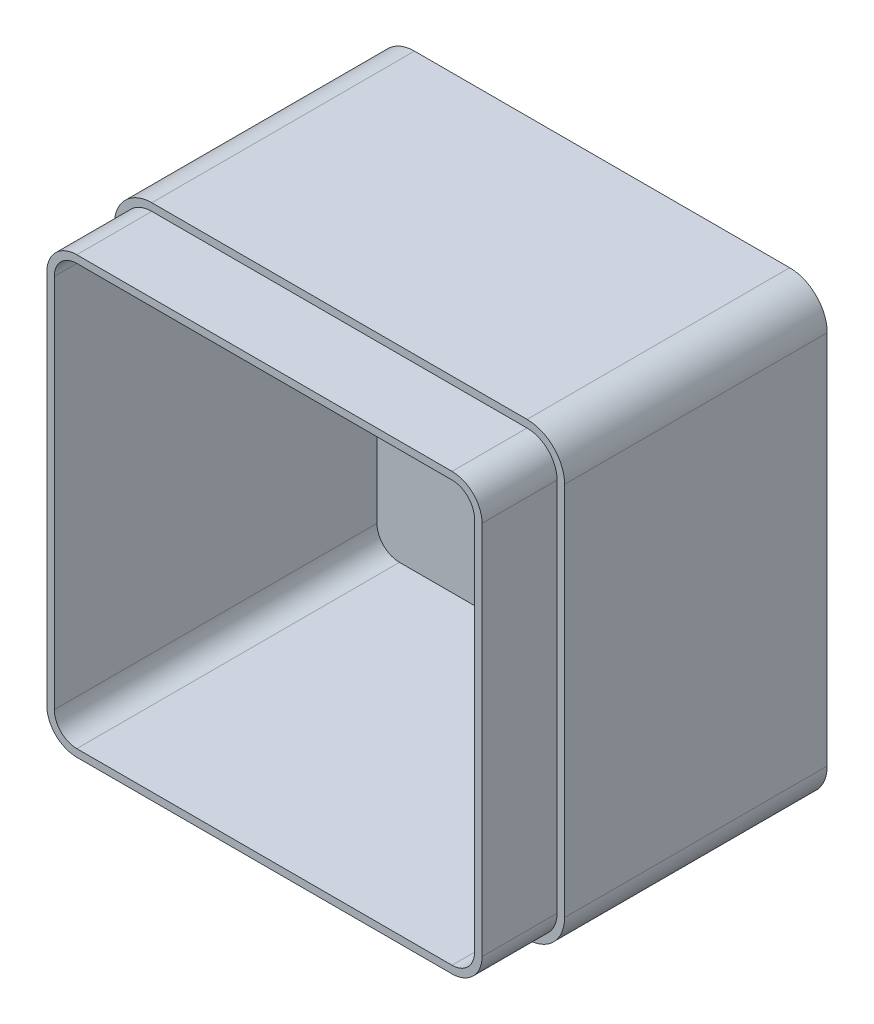
ISO-10303-21;
HEADER;
FILE_DESCRIPTION(('STEP AP214'),'2;1');
FILE_NAME('part.step','',(''),(''),'','','');
FILE_SCHEMA(('AUTOMOTIVE_DESIGN { 1 0 10303 214 1 1 1 1 }'));
ENDSEC;
DATA;
#1=APPLICATION_CONTEXT('core data for automotive mechanical design processes');
#2=APPLICATION_PROTOCOL_DEFINITION('international standard','automotive_design',2000,#1);
#3=PRODUCT_CONTEXT('',#1,'mechanical');
#4=PRODUCT('Part','Part','',(#3));
#5=PRODUCT_RELATED_PRODUCT_CATEGORY('part','',(#4));
#6=PRODUCT_DEFINITION_FORMATION('','',#4);
#7=PRODUCT_DEFINITION_CONTEXT('part definition',#1,'design');
#8=PRODUCT_DEFINITION('design','',#6,#7);
#9=PRODUCT_DEFINITION_SHAPE('','',#8);
#10=(LENGTH_UNIT() NAMED_UNIT(*) SI_UNIT(.MILLI.,.METRE.));
#11=(NAMED_UNIT(*) PLANE_ANGLE_UNIT() SI_UNIT($,.RADIAN.));
#12=(NAMED_UNIT(*) SI_UNIT($,.STERADIAN.) SOLID_ANGLE_UNIT());
#13=UNCERTAINTY_MEASURE_WITH_UNIT(LENGTH_MEASURE(1.E-05),#10,'distance_accuracy_value','');
#14=(GEOMETRIC_REPRESENTATION_CONTEXT(3) GLOBAL_UNCERTAINTY_ASSIGNED_CONTEXT((#13)) GLOBAL_UNIT_ASSIGNED_CONTEXT((#10,
#11,#12)) REPRESENTATION_CONTEXT('',''));
#15=CARTESIAN_POINT('',(0.,0.,0.));
#16=DIRECTION('',(0.,0.,1.));
#17=DIRECTION('',(1.,0.,0.));
#18=AXIS2_PLACEMENT_3D('',#15,#16,#17);
#19=CARTESIAN_POINT('',(0.,0.,90.));
#20=DIRECTION('',(0.,0.,-1.));
#21=DIRECTION('',(-1.,0.,0.));
#22=AXIS2_PLACEMENT_3D('',#19,#20,#21);
#23=PLANE('',#22);
#24=DIRECTION('',(0.,-1.,0.));
#25=VECTOR('',#24,1.);
#26=CARTESIAN_POINT('',(4.,0.,90.));
#27=LINE('',#26,#25);
#28=CARTESIAN_POINT('',(4.,110.,90.));
#29=VERTEX_POINT('',#28);
#30=CARTESIAN_POINT('',(4.,10.,90.));
#31=VERTEX_POINT('',#30);
#32=EDGE_CURVE('E304',#29,#31,#27,.T.);
#33=ORIENTED_EDGE('',*,*,#32,.F.);
#34=CARTESIAN_POINT('',(10.,110.,90.));
#35=DIRECTION('',(0.,0.,-1.));
#36=DIRECTION('',(-1.,0.,0.));
#37=AXIS2_PLACEMENT_3D('',#34,#35,#36);
#38=CIRCLE('',#37,6.);
#39=CARTESIAN_POINT('',(10.,116.,90.));
#40=VERTEX_POINT('',#39);
#41=EDGE_CURVE('E287',#40,#29,#38,.F.);
#42=ORIENTED_EDGE('',*,*,#41,.F.);
#43=DIRECTION('',(-1.,0.,0.));
#44=VECTOR('',#43,1.);
#45=CARTESIAN_POINT('',(0.,116.,90.));
#46=LINE('',#45,#44);
#47=CARTESIAN_POINT('',(110.,116.,90.));
#48=VERTEX_POINT('',#47);
#49=EDGE_CURVE('E313',#48,#40,#46,.T.);
#50=ORIENTED_EDGE('',*,*,#49,.F.);
#51=CARTESIAN_POINT('',(110.,110.,90.));
#52=DIRECTION('',(0.,0.,-1.));
#53=DIRECTION('',(-1.,0.,0.));
#54=AXIS2_PLACEMENT_3D('',#51,#52,#53);
#55=CIRCLE('',#54,6.);
#56=CARTESIAN_POINT('',(116.,110.,90.));
#57=VERTEX_POINT('',#56);
#58=EDGE_CURVE('E336',#57,#48,#55,.F.);
#59=ORIENTED_EDGE('',*,*,#58,.F.);
#60=DIRECTION('',(0.,1.,0.));
#61=VECTOR('',#60,1.);
#62=CARTESIAN_POINT('',(116.,0.,90.));
#63=LINE('',#62,#61);
#64=CARTESIAN_POINT('',(116.,10.,90.));
#65=VERTEX_POINT('',#64);
#66=EDGE_CURVE('E334',#65,#57,#63,.T.);
#67=ORIENTED_EDGE('',*,*,#66,.F.);
#68=CARTESIAN_POINT('',(110.,10.,90.));
#69=DIRECTION('',(0.,0.,-1.));
#70=DIRECTION('',(-1.,0.,0.));
#71=AXIS2_PLACEMENT_3D('',#68,#69,#70);
#72=CIRCLE('',#71,6.);
#73=CARTESIAN_POINT('',(110.,4.,90.));
#74=VERTEX_POINT('',#73);
#75=EDGE_CURVE('E331',#74,#65,#72,.F.);
#76=ORIENTED_EDGE('',*,*,#75,.F.);
#77=DIRECTION('',(1.,0.,0.));
#78=VECTOR('',#77,1.);
#79=CARTESIAN_POINT('',(0.,4.,90.));
#80=LINE('',#79,#78);
#81=CARTESIAN_POINT('',(10.,4.,90.));
#82=VERTEX_POINT('',#81);
#83=EDGE_CURVE('E329',#82,#74,#80,.T.);
#84=ORIENTED_EDGE('',*,*,#83,.F.);
#85=CARTESIAN_POINT('',(10.,10.,90.));
#86=DIRECTION('',(0.,0.,-1.));
#87=DIRECTION('',(-1.,0.,0.));
#88=AXIS2_PLACEMENT_3D('',#85,#86,#87);
#89=CIRCLE('',#88,6.);
#90=EDGE_CURVE('E320',#31,#82,#89,.F.);
#91=ORIENTED_EDGE('',*,*,#90,.F.);
#92=EDGE_LOOP('',(#33,#42,#50,#59,#67,#76,#84,#91));
#93=FACE_BOUND('',#92,.T.);
#94=CARTESIAN_POINT('',(10.,110.,90.));
#95=DIRECTION('',(0.,0.,1.));
#96=DIRECTION('',(1.,0.,0.));
#97=AXIS2_PLACEMENT_3D('',#94,#95,#96);
#98=CIRCLE('',#97,8.);
#99=CARTESIAN_POINT('',(10.,118.,90.));
#100=VERTEX_POINT('',#99);
#101=CARTESIAN_POINT('',(2.,110.,90.));
#102=VERTEX_POINT('',#101);
#103=EDGE_CURVE('E239',#100,#102,#98,.T.);
#104=ORIENTED_EDGE('',*,*,#103,.T.);
#105=DIRECTION('',(0.,-1.,0.));
#106=VECTOR('',#105,1.);
#107=CARTESIAN_POINT('',(2.,110.,90.));
#108=LINE('',#107,#106);
#109=CARTESIAN_POINT('',(2.,10.,90.));
#110=VERTEX_POINT('',#109);
#111=EDGE_CURVE('E199',#102,#110,#108,.T.);
#112=ORIENTED_EDGE('',*,*,#111,.T.);
#113=CARTESIAN_POINT('',(10.,10.,90.));
#114=DIRECTION('',(0.,0.,1.));
#115=DIRECTION('',(1.,0.,0.));
#116=AXIS2_PLACEMENT_3D('',#113,#114,#115);
#117=CIRCLE('',#116,8.);
#118=CARTESIAN_POINT('',(10.,2.,90.));
#119=VERTEX_POINT('',#118);
#120=EDGE_CURVE('E48',#110,#119,#117,.T.);
#121=ORIENTED_EDGE('',*,*,#120,.T.);
#122=DIRECTION('',(1.,0.,0.));
#123=VECTOR('',#122,1.);
#124=CARTESIAN_POINT('',(10.,2.,90.));
#125=LINE('',#124,#123);
#126=CARTESIAN_POINT('',(110.,2.,90.));
#127=VERTEX_POINT('',#126);
#128=EDGE_CURVE('E243',#119,#127,#125,.T.);
#129=ORIENTED_EDGE('',*,*,#128,.T.);
#130=CARTESIAN_POINT('',(110.,10.,90.));
#131=DIRECTION('',(0.,0.,1.));
#132=DIRECTION('',(1.,0.,0.));
#133=AXIS2_PLACEMENT_3D('',#130,#131,#132);
#134=CIRCLE('',#133,8.);
#135=CARTESIAN_POINT('',(118.,10.,90.));
#136=VERTEX_POINT('',#135);
#137=EDGE_CURVE('E246',#127,#136,#134,.T.);
#138=ORIENTED_EDGE('',*,*,#137,.T.);
#139=DIRECTION('',(0.,1.,0.));
#140=VECTOR('',#139,1.);
#141=CARTESIAN_POINT('',(118.,10.,90.));
#142=LINE('',#141,#140);
#143=CARTESIAN_POINT('',(118.,110.,90.));
#144=VERTEX_POINT('',#143);
#145=EDGE_CURVE('E249',#136,#144,#142,.T.);
#146=ORIENTED_EDGE('',*,*,#145,.T.);
#147=CARTESIAN_POINT('',(110.,110.,90.));
#148=DIRECTION('',(0.,0.,1.));
#149=DIRECTION('',(1.,0.,0.));
#150=AXIS2_PLACEMENT_3D('',#147,#148,#149);
#151=CIRCLE('',#150,7.99999999999999);
#152=CARTESIAN_POINT('',(110.,118.,90.));
#153=VERTEX_POINT('',#152);
#154=EDGE_CURVE('E222',#144,#153,#151,.T.);
#155=ORIENTED_EDGE('',*,*,#154,.T.);
#156=DIRECTION('',(-1.,0.,0.));
#157=VECTOR('',#156,1.);
#158=CARTESIAN_POINT('',(110.,118.,90.));
#159=LINE('',#158,#157);
#160=EDGE_CURVE('E219',#153,#100,#159,.T.);
#161=ORIENTED_EDGE('',*,*,#160,.T.);
#162=EDGE_LOOP('',(#104,#112,#121,#129,#138,#146,#155,#161));
#163=FACE_BOUND('',#162,.T.);
#164=ADVANCED_FACE('F33',(#93,#163),#23,.F.);
#165=CARTESIAN_POINT('',(4.,0.,90.));
#166=DIRECTION('',(1.,0.,0.));
#167=DIRECTION('',(0.,0.,-1.));
#168=AXIS2_PLACEMENT_3D('',#165,#166,#167);
#169=PLANE('',#168);
#170=DIRECTION('',(0.,-1.,0.));
#171=VECTOR('',#170,1.);
#172=CARTESIAN_POINT('',(4.,0.,4.));
#173=LINE('',#172,#171);
#174=CARTESIAN_POINT('',(4.,110.,4.));
#175=VERTEX_POINT('',#174);
#176=CARTESIAN_POINT('',(4.,10.,4.));
#177=VERTEX_POINT('',#176);
#178=EDGE_CURVE('E281',#175,#177,#173,.T.);
#179=ORIENTED_EDGE('',*,*,#178,.F.);
#180=DIRECTION('',(0.,0.,-1.));
#181=VECTOR('',#180,1.);
#182=CARTESIAN_POINT('',(4.,110.,90.));
#183=LINE('',#182,#181);
#184=EDGE_CURVE('E288',#29,#175,#183,.T.);
#185=ORIENTED_EDGE('',*,*,#184,.F.);
#186=ORIENTED_EDGE('',*,*,#32,.T.);
#187=DIRECTION('',(0.,0.,-1.));
#188=VECTOR('',#187,1.);
#189=CARTESIAN_POINT('',(4.,10.,90.));
#190=LINE('',#189,#188);
#191=EDGE_CURVE('E285',#177,#31,#190,.F.);
#192=ORIENTED_EDGE('',*,*,#191,.F.);
#193=EDGE_LOOP('',(#179,#185,#186,#192));
#194=FACE_BOUND('',#193,.T.);
#195=ADVANCED_FACE('F426',(#194),#169,.T.);
#196=CARTESIAN_POINT('',(0.,4.,90.));
#197=DIRECTION('',(0.,1.,0.));
#198=DIRECTION('',(0.,0.,1.));
#199=AXIS2_PLACEMENT_3D('',#196,#197,#198);
#200=PLANE('',#199);
#201=ORIENTED_EDGE('',*,*,#83,.T.);
#202=DIRECTION('',(0.,0.,1.));
#203=VECTOR('',#202,1.);
#204=CARTESIAN_POINT('',(110.,4.,90.));
#205=LINE('',#204,#203);
#206=CARTESIAN_POINT('',(110.,4.,4.));
#207=VERTEX_POINT('',#206);
#208=EDGE_CURVE('E311',#207,#74,#205,.T.);
#209=ORIENTED_EDGE('',*,*,#208,.F.);
#210=DIRECTION('',(1.,0.,0.));
#211=VECTOR('',#210,1.);
#212=CARTESIAN_POINT('',(0.,4.,4.));
#213=LINE('',#212,#211);
#214=CARTESIAN_POINT('',(10.,4.,4.));
#215=VERTEX_POINT('',#214);
#216=EDGE_CURVE('E284',#215,#207,#213,.T.);
#217=ORIENTED_EDGE('',*,*,#216,.F.);
#218=DIRECTION('',(0.,0.,1.));
#219=VECTOR('',#218,1.);
#220=CARTESIAN_POINT('',(10.,4.,90.));
#221=LINE('',#220,#219);
#222=EDGE_CURVE('E300',#82,#215,#221,.F.);
#223=ORIENTED_EDGE('',*,*,#222,.F.);
#224=EDGE_LOOP('',(#201,#209,#217,#223));
#225=FACE_BOUND('',#224,.T.);
#226=ADVANCED_FACE('F431',(#225),#200,.T.);
#227=CARTESIAN_POINT('',(116.,0.,90.));
#228=DIRECTION('',(-1.,0.,0.));
#229=DIRECTION('',(0.,0.,1.));
#230=AXIS2_PLACEMENT_3D('',#227,#228,#229);
#231=PLANE('',#230);
#232=ORIENTED_EDGE('',*,*,#66,.T.);
#233=DIRECTION('',(0.,0.,1.));
#234=VECTOR('',#233,1.);
#235=CARTESIAN_POINT('',(116.,110.,90.));
#236=LINE('',#235,#234);
#237=CARTESIAN_POINT('',(116.,110.,4.));
#238=VERTEX_POINT('',#237);
#239=EDGE_CURVE('E318',#238,#57,#236,.T.);
#240=ORIENTED_EDGE('',*,*,#239,.F.);
#241=DIRECTION('',(0.,1.,0.));
#242=VECTOR('',#241,1.);
#243=CARTESIAN_POINT('',(116.,0.,4.));
#244=LINE('',#243,#242);
#245=CARTESIAN_POINT('',(116.,10.,4.));
#246=VERTEX_POINT('',#245);
#247=EDGE_CURVE('E294',#246,#238,#244,.T.);
#248=ORIENTED_EDGE('',*,*,#247,.F.);
#249=DIRECTION('',(0.,0.,1.));
#250=VECTOR('',#249,1.);
#251=CARTESIAN_POINT('',(116.,10.,90.));
#252=LINE('',#251,#250);
#253=EDGE_CURVE('E314',#65,#246,#252,.F.);
#254=ORIENTED_EDGE('',*,*,#253,.F.);
#255=EDGE_LOOP('',(#232,#240,#248,#254));
#256=FACE_BOUND('',#255,.T.);
#257=ADVANCED_FACE('F460',(#256),#231,.T.);
#258=CARTESIAN_POINT('',(0.,116.,90.));
#259=DIRECTION('',(0.,-1.,0.));
#260=DIRECTION('',(0.,0.,-1.));
#261=AXIS2_PLACEMENT_3D('',#258,#259,#260);
#262=PLANE('',#261);
#263=ORIENTED_EDGE('',*,*,#49,.T.);
#264=DIRECTION('',(0.,0.,-1.));
#265=VECTOR('',#264,1.);
#266=CARTESIAN_POINT('',(10.,116.,90.));
#267=LINE('',#266,#265);
#268=CARTESIAN_POINT('',(10.,116.,4.));
#269=VERTEX_POINT('',#268);
#270=EDGE_CURVE('E317',#269,#40,#267,.F.);
#271=ORIENTED_EDGE('',*,*,#270,.F.);
#272=DIRECTION('',(-1.,0.,0.));
#273=VECTOR('',#272,1.);
#274=CARTESIAN_POINT('',(0.,116.,4.));
#275=LINE('',#274,#273);
#276=CARTESIAN_POINT('',(110.,116.,4.));
#277=VERTEX_POINT('',#276);
#278=EDGE_CURVE('E301',#277,#269,#275,.T.);
#279=ORIENTED_EDGE('',*,*,#278,.F.);
#280=DIRECTION('',(0.,0.,-1.));
#281=VECTOR('',#280,1.);
#282=CARTESIAN_POINT('',(110.,116.,90.));
#283=LINE('',#282,#281);
#284=EDGE_CURVE('E321',#48,#277,#283,.T.);
#285=ORIENTED_EDGE('',*,*,#284,.F.);
#286=EDGE_LOOP('',(#263,#271,#279,#285));
#287=FACE_BOUND('',#286,.T.);
#288=ADVANCED_FACE('F456',(#287),#262,.T.);
#289=CARTESIAN_POINT('',(0.,0.,4.));
#290=DIRECTION('',(0.,0.,-1.));
#291=DIRECTION('',(-1.,0.,0.));
#292=AXIS2_PLACEMENT_3D('',#289,#290,#291);
#293=PLANE('',#292);
#294=ORIENTED_EDGE('',*,*,#216,.T.);
#295=CARTESIAN_POINT('',(110.,10.,4.));
#296=DIRECTION('',(0.,0.,-1.));
#297=DIRECTION('',(-1.,0.,0.));
#298=AXIS2_PLACEMENT_3D('',#295,#296,#297);
#299=CIRCLE('',#298,6.);
#300=EDGE_CURVE('E296',#246,#207,#299,.T.);
#301=ORIENTED_EDGE('',*,*,#300,.F.);
#302=ORIENTED_EDGE('',*,*,#247,.T.);
#303=CARTESIAN_POINT('',(110.,110.,4.));
#304=DIRECTION('',(0.,0.,-1.));
#305=DIRECTION('',(-1.,0.,0.));
#306=AXIS2_PLACEMENT_3D('',#303,#304,#305);
#307=CIRCLE('',#306,6.);
#308=EDGE_CURVE('E299',#277,#238,#307,.T.);
#309=ORIENTED_EDGE('',*,*,#308,.F.);
#310=ORIENTED_EDGE('',*,*,#278,.T.);
#311=CARTESIAN_POINT('',(10.,110.,4.));
#312=DIRECTION('',(0.,0.,-1.));
#313=DIRECTION('',(-1.,0.,0.));
#314=AXIS2_PLACEMENT_3D('',#311,#312,#313);
#315=CIRCLE('',#314,6.);
#316=EDGE_CURVE('E297',#175,#269,#315,.T.);
#317=ORIENTED_EDGE('',*,*,#316,.F.);
#318=ORIENTED_EDGE('',*,*,#178,.T.);
#319=CARTESIAN_POINT('',(10.,10.,4.));
#320=DIRECTION('',(0.,0.,-1.));
#321=DIRECTION('',(-1.,0.,0.));
#322=AXIS2_PLACEMENT_3D('',#319,#320,#321);
#323=CIRCLE('',#322,6.);
#324=EDGE_CURVE('E291',#215,#177,#323,.T.);
#325=ORIENTED_EDGE('',*,*,#324,.F.);
#326=EDGE_LOOP('',(#294,#301,#302,#309,#310,#317,#318,#325));
#327=FACE_BOUND('',#326,.T.);
#328=ADVANCED_FACE('F452',(#327),#293,.F.);
#329=CARTESIAN_POINT('',(10.,10.,90.));
#330=DIRECTION('',(0.,0.,-1.));
#331=DIRECTION('',(-1.,0.,0.));
#332=AXIS2_PLACEMENT_3D('',#329,#330,#331);
#333=CYLINDRICAL_SURFACE('',#332,6.);
#334=ORIENTED_EDGE('',*,*,#90,.T.);
#335=ORIENTED_EDGE('',*,*,#222,.T.);
#336=ORIENTED_EDGE('',*,*,#324,.T.);
#337=ORIENTED_EDGE('',*,*,#191,.T.);
#338=EDGE_LOOP('',(#334,#335,#336,#337));
#339=FACE_BOUND('',#338,.T.);
#340=ADVANCED_FACE('F448',(#339),#333,.F.);
#341=CARTESIAN_POINT('',(110.,10.,90.));
#342=DIRECTION('',(0.,0.,-1.));
#343=DIRECTION('',(-1.,0.,0.));
#344=AXIS2_PLACEMENT_3D('',#341,#342,#343);
#345=CYLINDRICAL_SURFACE('',#344,6.);
#346=ORIENTED_EDGE('',*,*,#75,.T.);
#347=ORIENTED_EDGE('',*,*,#253,.T.);
#348=ORIENTED_EDGE('',*,*,#300,.T.);
#349=ORIENTED_EDGE('',*,*,#208,.T.);
#350=EDGE_LOOP('',(#346,#347,#348,#349));
#351=FACE_BOUND('',#350,.T.);
#352=ADVANCED_FACE('F444',(#351),#345,.F.);
#353=CARTESIAN_POINT('',(110.,110.,90.));
#354=DIRECTION('',(0.,0.,-1.));
#355=DIRECTION('',(-1.,0.,0.));
#356=AXIS2_PLACEMENT_3D('',#353,#354,#355);
#357=CYLINDRICAL_SURFACE('',#356,6.);
#358=ORIENTED_EDGE('',*,*,#58,.T.);
#359=ORIENTED_EDGE('',*,*,#284,.T.);
#360=ORIENTED_EDGE('',*,*,#308,.T.);
#361=ORIENTED_EDGE('',*,*,#239,.T.);
#362=EDGE_LOOP('',(#358,#359,#360,#361));
#363=FACE_BOUND('',#362,.T.);
#364=ADVANCED_FACE('F440',(#363),#357,.F.);
#365=CARTESIAN_POINT('',(10.,110.,90.));
#366=DIRECTION('',(0.,0.,-1.));
#367=DIRECTION('',(-1.,0.,0.));
#368=AXIS2_PLACEMENT_3D('',#365,#366,#367);
#369=CYLINDRICAL_SURFACE('',#368,6.);
#370=ORIENTED_EDGE('',*,*,#41,.T.);
#371=ORIENTED_EDGE('',*,*,#184,.T.);
#372=ORIENTED_EDGE('',*,*,#316,.T.);
#373=ORIENTED_EDGE('',*,*,#270,.T.);
#374=EDGE_LOOP('',(#370,#371,#372,#373));
#375=FACE_BOUND('',#374,.T.);
#376=ADVANCED_FACE('F437',(#375),#369,.F.);
#377=CARTESIAN_POINT('',(10.,110.,70.));
#378=DIRECTION('',(0.,0.,1.));
#379=DIRECTION('',(1.,0.,0.));
#380=AXIS2_PLACEMENT_3D('',#377,#378,#379);
#381=PLANE('',#380);
#382=DIRECTION('',(-1.,0.,0.));
#383=VECTOR('',#382,1.);
#384=CARTESIAN_POINT('',(110.,118.,70.));
#385=LINE('',#384,#383);
#386=CARTESIAN_POINT('',(110.,118.,70.));
#387=VERTEX_POINT('',#386);
#388=CARTESIAN_POINT('',(10.,118.,70.));
#389=VERTEX_POINT('',#388);
#390=EDGE_CURVE('E205',#387,#389,#385,.T.);
#391=ORIENTED_EDGE('',*,*,#390,.F.);
#392=CARTESIAN_POINT('',(110.,110.,70.));
#393=DIRECTION('',(0.,0.,1.));
#394=DIRECTION('',(1.,0.,0.));
#395=AXIS2_PLACEMENT_3D('',#392,#393,#394);
#396=CIRCLE('',#395,7.99999999999999);
#397=CARTESIAN_POINT('',(118.,110.,70.));
#398=VERTEX_POINT('',#397);
#399=EDGE_CURVE('E235',#398,#387,#396,.T.);
#400=ORIENTED_EDGE('',*,*,#399,.F.);
#401=DIRECTION('',(0.,1.,0.));
#402=VECTOR('',#401,1.);
#403=CARTESIAN_POINT('',(118.,10.,70.));
#404=LINE('',#403,#402);
#405=CARTESIAN_POINT('',(118.,10.,70.));
#406=VERTEX_POINT('',#405);
#407=EDGE_CURVE('E232',#406,#398,#404,.T.);
#408=ORIENTED_EDGE('',*,*,#407,.F.);
#409=CARTESIAN_POINT('',(110.,10.,70.));
#410=DIRECTION('',(0.,0.,1.));
#411=DIRECTION('',(1.,0.,0.));
#412=AXIS2_PLACEMENT_3D('',#409,#410,#411);
#413=CIRCLE('',#412,8.);
#414=CARTESIAN_POINT('',(110.,2.,70.));
#415=VERTEX_POINT('',#414);
#416=EDGE_CURVE('E229',#415,#406,#413,.T.);
#417=ORIENTED_EDGE('',*,*,#416,.F.);
#418=DIRECTION('',(1.,0.,0.));
#419=VECTOR('',#418,1.);
#420=CARTESIAN_POINT('',(10.,2.,70.));
#421=LINE('',#420,#419);
#422=CARTESIAN_POINT('',(10.,2.,70.));
#423=VERTEX_POINT('',#422);
#424=EDGE_CURVE('E226',#423,#415,#421,.T.);
#425=ORIENTED_EDGE('',*,*,#424,.F.);
#426=CARTESIAN_POINT('',(10.,10.,70.));
#427=DIRECTION('',(0.,0.,1.));
#428=DIRECTION('',(1.,0.,0.));
#429=AXIS2_PLACEMENT_3D('',#426,#427,#428);
#430=CIRCLE('',#429,8.);
#431=CARTESIAN_POINT('',(2.,9.99999999999999,70.));
#432=VERTEX_POINT('',#431);
#433=EDGE_CURVE('E215',#432,#423,#430,.T.);
#434=ORIENTED_EDGE('',*,*,#433,.F.);
#435=DIRECTION('',(0.,-1.,0.));
#436=VECTOR('',#435,1.);
#437=CARTESIAN_POINT('',(2.,110.,70.));
#438=LINE('',#437,#436);
#439=CARTESIAN_POINT('',(2.,110.,70.));
#440=VERTEX_POINT('',#439);
#441=EDGE_CURVE('E197',#440,#432,#438,.T.);
#442=ORIENTED_EDGE('',*,*,#441,.F.);
#443=CARTESIAN_POINT('',(10.,110.,70.));
#444=DIRECTION('',(0.,0.,1.));
#445=DIRECTION('',(1.,0.,0.));
#446=AXIS2_PLACEMENT_3D('',#443,#444,#445);
#447=CIRCLE('',#446,8.);
#448=EDGE_CURVE('E211',#389,#440,#447,.T.);
#449=ORIENTED_EDGE('',*,*,#448,.F.);
#450=EDGE_LOOP('',(#391,#400,#408,#417,#425,#434,#442,#449));
#451=FACE_BOUND('',#450,.T.);
#452=CARTESIAN_POINT('',(10.,110.,70.));
#453=DIRECTION('',(0.,0.,1.));
#454=DIRECTION('',(1.,0.,0.));
#455=AXIS2_PLACEMENT_3D('',#452,#453,#454);
#456=CIRCLE('',#455,10.);
#457=CARTESIAN_POINT('',(10.,120.,70.));
#458=VERTEX_POINT('',#457);
#459=CARTESIAN_POINT('',(0.,110.,70.));
#460=VERTEX_POINT('',#459);
#461=EDGE_CURVE('E255',#458,#460,#456,.T.);
#462=ORIENTED_EDGE('',*,*,#461,.T.);
#463=DIRECTION('',(0.,-1.,0.));
#464=VECTOR('',#463,1.);
#465=CARTESIAN_POINT('',(0.,110.,70.));
#466=LINE('',#465,#464);
#467=CARTESIAN_POINT('',(0.,10.,70.));
#468=VERTEX_POINT('',#467);
#469=EDGE_CURVE('E268',#460,#468,#466,.T.);
#470=ORIENTED_EDGE('',*,*,#469,.T.);
#471=CARTESIAN_POINT('',(10.,10.,70.));
#472=DIRECTION('',(0.,0.,1.));
#473=DIRECTION('',(1.,0.,0.));
#474=AXIS2_PLACEMENT_3D('',#471,#472,#473);
#475=CIRCLE('',#474,10.);
#476=CARTESIAN_POINT('',(10.,0.,70.));
#477=VERTEX_POINT('',#476);
#478=EDGE_CURVE('E270',#468,#477,#475,.T.);
#479=ORIENTED_EDGE('',*,*,#478,.T.);
#480=DIRECTION('',(1.,0.,0.));
#481=VECTOR('',#480,1.);
#482=CARTESIAN_POINT('',(10.,0.,70.));
#483=LINE('',#482,#481);
#484=CARTESIAN_POINT('',(110.,0.,70.));
#485=VERTEX_POINT('',#484);
#486=EDGE_CURVE('E272',#477,#485,#483,.T.);
#487=ORIENTED_EDGE('',*,*,#486,.T.);
#488=CARTESIAN_POINT('',(110.,10.,70.));
#489=DIRECTION('',(0.,0.,1.));
#490=DIRECTION('',(1.,0.,0.));
#491=AXIS2_PLACEMENT_3D('',#488,#489,#490);
#492=CIRCLE('',#491,10.);
#493=CARTESIAN_POINT('',(120.,10.,70.));
#494=VERTEX_POINT('',#493);
#495=EDGE_CURVE('E274',#485,#494,#492,.T.);
#496=ORIENTED_EDGE('',*,*,#495,.T.);
#497=DIRECTION('',(0.,1.,0.));
#498=VECTOR('',#497,1.);
#499=CARTESIAN_POINT('',(120.,10.,70.));
#500=LINE('',#499,#498);
#501=CARTESIAN_POINT('',(120.,110.,70.));
#502=VERTEX_POINT('',#501);
#503=EDGE_CURVE('E276',#494,#502,#500,.T.);
#504=ORIENTED_EDGE('',*,*,#503,.T.);
#505=CARTESIAN_POINT('',(110.,110.,70.));
#506=DIRECTION('',(0.,0.,1.));
#507=DIRECTION('',(1.,0.,0.));
#508=AXIS2_PLACEMENT_3D('',#505,#506,#507);
#509=CIRCLE('',#508,9.99999999999999);
#510=CARTESIAN_POINT('',(110.,120.,70.));
#511=VERTEX_POINT('',#510);
#512=EDGE_CURVE('E278',#502,#511,#509,.T.);
#513=ORIENTED_EDGE('',*,*,#512,.T.);
#514=DIRECTION('',(-1.,0.,0.));
#515=VECTOR('',#514,1.);
#516=CARTESIAN_POINT('',(110.,120.,70.));
#517=LINE('',#516,#515);
#518=EDGE_CURVE('E56',#511,#458,#517,.T.);
#519=ORIENTED_EDGE('',*,*,#518,.T.);
#520=EDGE_LOOP('',(#462,#470,#479,#487,#496,#504,#513,#519));
#521=FACE_BOUND('',#520,.T.);
#522=ADVANCED_FACE('F210',(#451,#521),#381,.T.);
#523=CARTESIAN_POINT('',(10.,110.,70.));
#524=DIRECTION('',(0.,0.,1.));
#525=DIRECTION('',(1.,0.,0.));
#526=AXIS2_PLACEMENT_3D('',#523,#524,#525);
#527=CYLINDRICAL_SURFACE('',#526,8.);
#528=ORIENTED_EDGE('',*,*,#103,.F.);
#529=DIRECTION('',(0.,0.,1.));
#530=VECTOR('',#529,1.);
#531=CARTESIAN_POINT('',(10.,118.,70.));
#532=LINE('',#531,#530);
#533=EDGE_CURVE('E218',#389,#100,#532,.T.);
#534=ORIENTED_EDGE('',*,*,#533,.F.);
#535=ORIENTED_EDGE('',*,*,#448,.T.);
#536=DIRECTION('',(0.,0.,1.));
#537=VECTOR('',#536,1.);
#538=CARTESIAN_POINT('',(2.,110.,70.));
#539=LINE('',#538,#537);
#540=EDGE_CURVE('E194',#440,#102,#539,.T.);
#541=ORIENTED_EDGE('',*,*,#540,.T.);
#542=EDGE_LOOP('',(#528,#534,#535,#541));
#543=FACE_BOUND('',#542,.T.);
#544=ADVANCED_FACE('F217',(#543),#527,.T.);
#545=CARTESIAN_POINT('',(110.,118.,70.));
#546=DIRECTION('',(0.,1.,0.));
#547=DIRECTION('',(0.,0.,1.));
#548=AXIS2_PLACEMENT_3D('',#545,#546,#547);
#549=PLANE('',#548);
#550=ORIENTED_EDGE('',*,*,#160,.F.);
#551=DIRECTION('',(0.,0.,1.));
#552=VECTOR('',#551,1.);
#553=CARTESIAN_POINT('',(110.,118.,70.));
#554=LINE('',#553,#552);
#555=EDGE_CURVE('E256',#387,#153,#554,.T.);
#556=ORIENTED_EDGE('',*,*,#555,.F.);
#557=ORIENTED_EDGE('',*,*,#390,.T.);
#558=ORIENTED_EDGE('',*,*,#533,.T.);
#559=EDGE_LOOP('',(#550,#556,#557,#558));
#560=FACE_BOUND('',#559,.T.);
#561=ADVANCED_FACE('F471',(#560),#549,.T.);
#562=CARTESIAN_POINT('',(110.,110.,70.));
#563=DIRECTION('',(0.,0.,1.));
#564=DIRECTION('',(1.,0.,0.));
#565=AXIS2_PLACEMENT_3D('',#562,#563,#564);
#566=CYLINDRICAL_SURFACE('',#565,7.99999999999999);
#567=ORIENTED_EDGE('',*,*,#154,.F.);
#568=DIRECTION('',(0.,0.,1.));
#569=VECTOR('',#568,1.);
#570=CARTESIAN_POINT('',(118.,110.,70.));
#571=LINE('',#570,#569);
#572=EDGE_CURVE('E258',#398,#144,#571,.T.);
#573=ORIENTED_EDGE('',*,*,#572,.F.);
#574=ORIENTED_EDGE('',*,*,#399,.T.);
#575=ORIENTED_EDGE('',*,*,#555,.T.);
#576=EDGE_LOOP('',(#567,#573,#574,#575));
#577=FACE_BOUND('',#576,.T.);
#578=ADVANCED_FACE('F486',(#577),#566,.T.);
#579=CARTESIAN_POINT('',(118.,10.,70.));
#580=DIRECTION('',(1.,0.,0.));
#581=DIRECTION('',(0.,0.,-1.));
#582=AXIS2_PLACEMENT_3D('',#579,#580,#581);
#583=PLANE('',#582);
#584=ORIENTED_EDGE('',*,*,#145,.F.);
#585=DIRECTION('',(0.,0.,1.));
#586=VECTOR('',#585,1.);
#587=CARTESIAN_POINT('',(118.,10.,70.));
#588=LINE('',#587,#586);
#589=EDGE_CURVE('E260',#406,#136,#588,.T.);
#590=ORIENTED_EDGE('',*,*,#589,.F.);
#591=ORIENTED_EDGE('',*,*,#407,.T.);
#592=ORIENTED_EDGE('',*,*,#572,.T.);
#593=EDGE_LOOP('',(#584,#590,#591,#592));
#594=FACE_BOUND('',#593,.T.);
#595=ADVANCED_FACE('F482',(#594),#583,.T.);
#596=CARTESIAN_POINT('',(110.,10.,70.));
#597=DIRECTION('',(0.,0.,1.));
#598=DIRECTION('',(1.,0.,0.));
#599=AXIS2_PLACEMENT_3D('',#596,#597,#598);
#600=CYLINDRICAL_SURFACE('',#599,8.);
#601=ORIENTED_EDGE('',*,*,#137,.F.);
#602=DIRECTION('',(0.,0.,1.));
#603=VECTOR('',#602,1.);
#604=CARTESIAN_POINT('',(110.,2.,70.));
#605=LINE('',#604,#603);
#606=EDGE_CURVE('E262',#415,#127,#605,.T.);
#607=ORIENTED_EDGE('',*,*,#606,.F.);
#608=ORIENTED_EDGE('',*,*,#416,.T.);
#609=ORIENTED_EDGE('',*,*,#589,.T.);
#610=EDGE_LOOP('',(#601,#607,#608,#609));
#611=FACE_BOUND('',#610,.T.);
#612=ADVANCED_FACE('F478',(#611),#600,.T.);
#613=CARTESIAN_POINT('',(10.,2.,70.));
#614=DIRECTION('',(0.,-1.,0.));
#615=DIRECTION('',(0.,0.,-1.));
#616=AXIS2_PLACEMENT_3D('',#613,#614,#615);
#617=PLANE('',#616);
#618=ORIENTED_EDGE('',*,*,#128,.F.);
#619=DIRECTION('',(0.,0.,1.));
#620=VECTOR('',#619,1.);
#621=CARTESIAN_POINT('',(10.,2.,70.));
#622=LINE('',#621,#620);
#623=EDGE_CURVE('E264',#423,#119,#622,.T.);
#624=ORIENTED_EDGE('',*,*,#623,.F.);
#625=ORIENTED_EDGE('',*,*,#424,.T.);
#626=ORIENTED_EDGE('',*,*,#606,.T.);
#627=EDGE_LOOP('',(#618,#624,#625,#626));
#628=FACE_BOUND('',#627,.T.);
#629=ADVANCED_FACE('F475',(#628),#617,.T.);
#630=CARTESIAN_POINT('',(10.,10.,70.));
#631=DIRECTION('',(0.,0.,1.));
#632=DIRECTION('',(1.,0.,0.));
#633=AXIS2_PLACEMENT_3D('',#630,#631,#632);
#634=CYLINDRICAL_SURFACE('',#633,8.);
#635=ORIENTED_EDGE('',*,*,#120,.F.);
#636=DIRECTION('',(0.,0.,1.));
#637=VECTOR('',#636,1.);
#638=CARTESIAN_POINT('',(2.,10.,70.));
#639=LINE('',#638,#637);
#640=EDGE_CURVE('E204',#432,#110,#639,.T.);
#641=ORIENTED_EDGE('',*,*,#640,.F.);
#642=ORIENTED_EDGE('',*,*,#433,.T.);
#643=ORIENTED_EDGE('',*,*,#623,.T.);
#644=EDGE_LOOP('',(#635,#641,#642,#643));
#645=FACE_BOUND('',#644,.T.);
#646=ADVANCED_FACE('F421',(#645),#634,.T.);
#647=CARTESIAN_POINT('',(2.,110.,70.));
#648=DIRECTION('',(-1.,0.,0.));
#649=DIRECTION('',(0.,-1.,0.));
#650=AXIS2_PLACEMENT_3D('',#647,#648,#649);
#651=PLANE('',#650);
#652=ORIENTED_EDGE('',*,*,#111,.F.);
#653=ORIENTED_EDGE('',*,*,#540,.F.);
#654=ORIENTED_EDGE('',*,*,#441,.T.);
#655=ORIENTED_EDGE('',*,*,#640,.T.);
#656=EDGE_LOOP('',(#652,#653,#654,#655));
#657=FACE_BOUND('',#656,.T.);
#658=ADVANCED_FACE('F196',(#657),#651,.T.);
#659=CARTESIAN_POINT('',(0.,0.,0.));
#660=DIRECTION('',(0.,0.,-1.));
#661=DIRECTION('',(-1.,0.,0.));
#662=AXIS2_PLACEMENT_3D('',#659,#660,#661);
#663=PLANE('',#662);
#664=DIRECTION('',(1.,0.,0.));
#665=VECTOR('',#664,1.);
#666=CARTESIAN_POINT('',(0.,0.,0.));
#667=LINE('',#666,#665);
#668=CARTESIAN_POINT('',(10.,0.,0.));
#669=VERTEX_POINT('',#668);
#670=CARTESIAN_POINT('',(110.,0.,0.));
#671=VERTEX_POINT('',#670);
#672=EDGE_CURVE('E344',#669,#671,#667,.T.);
#673=ORIENTED_EDGE('',*,*,#672,.F.);
#674=CARTESIAN_POINT('',(10.,10.,0.));
#675=DIRECTION('',(0.,0.,-1.));
#676=DIRECTION('',(-1.,0.,0.));
#677=AXIS2_PLACEMENT_3D('',#674,#675,#676);
#678=CIRCLE('',#677,10.);
#679=CARTESIAN_POINT('',(0.,10.,0.));
#680=VERTEX_POINT('',#679);
#681=EDGE_CURVE('E364',#669,#680,#678,.T.);
#682=ORIENTED_EDGE('',*,*,#681,.T.);
#683=DIRECTION('',(0.,-1.,0.));
#684=VECTOR('',#683,1.);
#685=CARTESIAN_POINT('',(0.,0.,0.));
#686=LINE('',#685,#684);
#687=CARTESIAN_POINT('',(0.,110.,0.));
#688=VERTEX_POINT('',#687);
#689=EDGE_CURVE('E324',#688,#680,#686,.T.);
#690=ORIENTED_EDGE('',*,*,#689,.F.);
#691=CARTESIAN_POINT('',(10.,110.,0.));
#692=DIRECTION('',(0.,0.,-1.));
#693=DIRECTION('',(-1.,0.,0.));
#694=AXIS2_PLACEMENT_3D('',#691,#692,#693);
#695=CIRCLE('',#694,10.);
#696=CARTESIAN_POINT('',(10.,120.,0.));
#697=VERTEX_POINT('',#696);
#698=EDGE_CURVE('E358',#688,#697,#695,.T.);
#699=ORIENTED_EDGE('',*,*,#698,.T.);
#700=DIRECTION('',(-1.,0.,0.));
#701=VECTOR('',#700,1.);
#702=CARTESIAN_POINT('',(0.,120.,0.));
#703=LINE('',#702,#701);
#704=CARTESIAN_POINT('',(110.,120.,0.));
#705=VERTEX_POINT('',#704);
#706=EDGE_CURVE('E350',#705,#697,#703,.T.);
#707=ORIENTED_EDGE('',*,*,#706,.F.);
#708=CARTESIAN_POINT('',(110.,110.,0.));
#709=DIRECTION('',(0.,0.,-1.));
#710=DIRECTION('',(-1.,0.,0.));
#711=AXIS2_PLACEMENT_3D('',#708,#709,#710);
#712=CIRCLE('',#711,10.);
#713=CARTESIAN_POINT('',(120.,110.,0.));
#714=VERTEX_POINT('',#713);
#715=EDGE_CURVE('E360',#705,#714,#712,.T.);
#716=ORIENTED_EDGE('',*,*,#715,.T.);
#717=DIRECTION('',(0.,1.,0.));
#718=VECTOR('',#717,1.);
#719=CARTESIAN_POINT('',(120.,0.,0.));
#720=LINE('',#719,#718);
#721=CARTESIAN_POINT('',(120.,10.,0.));
#722=VERTEX_POINT('',#721);
#723=EDGE_CURVE('E347',#722,#714,#720,.T.);
#724=ORIENTED_EDGE('',*,*,#723,.F.);
#725=CARTESIAN_POINT('',(110.,10.,0.));
#726=DIRECTION('',(0.,0.,-1.));
#727=DIRECTION('',(-1.,0.,0.));
#728=AXIS2_PLACEMENT_3D('',#725,#726,#727);
#729=CIRCLE('',#728,10.);
#730=EDGE_CURVE('E362',#722,#671,#729,.T.);
#731=ORIENTED_EDGE('',*,*,#730,.T.);
#732=EDGE_LOOP('',(#673,#682,#690,#699,#707,#716,#724,#731));
#733=FACE_BOUND('',#732,.T.);
#734=ADVANCED_FACE('F414',(#733),#663,.T.);
#735=CARTESIAN_POINT('',(10.,110.,90.));
#736=DIRECTION('',(0.,0.,-1.));
#737=DIRECTION('',(-1.,0.,0.));
#738=AXIS2_PLACEMENT_3D('',#735,#736,#737);
#739=CYLINDRICAL_SURFACE('',#738,10.);
#740=DIRECTION('',(0.,0.,-1.));
#741=VECTOR('',#740,1.);
#742=CARTESIAN_POINT('',(0.,110.,90.));
#743=LINE('',#742,#741);
#744=EDGE_CURVE('E366',#460,#688,#743,.T.);
#745=ORIENTED_EDGE('',*,*,#744,.F.);
#746=ORIENTED_EDGE('',*,*,#461,.F.);
#747=DIRECTION('',(0.,0.,-1.));
#748=VECTOR('',#747,1.);
#749=CARTESIAN_POINT('',(10.,120.,90.));
#750=LINE('',#749,#748);
#751=EDGE_CURVE('E41',#697,#458,#750,.F.);
#752=ORIENTED_EDGE('',*,*,#751,.F.);
#753=ORIENTED_EDGE('',*,*,#698,.F.);
#754=EDGE_LOOP('',(#745,#746,#752,#753));
#755=FACE_BOUND('',#754,.T.);
#756=ADVANCED_FACE('F35',(#755),#739,.T.);
#757=CARTESIAN_POINT('',(110.,110.,90.));
#758=DIRECTION('',(0.,0.,-1.));
#759=DIRECTION('',(-1.,0.,0.));
#760=AXIS2_PLACEMENT_3D('',#757,#758,#759);
#761=CYLINDRICAL_SURFACE('',#760,10.);
#762=DIRECTION('',(0.,0.,-1.));
#763=VECTOR('',#762,1.);
#764=CARTESIAN_POINT('',(110.,120.,90.));
#765=LINE('',#764,#763);
#766=EDGE_CURVE('E11',#511,#705,#765,.T.);
#767=ORIENTED_EDGE('',*,*,#766,.F.);
#768=ORIENTED_EDGE('',*,*,#512,.F.);
#769=DIRECTION('',(0.,0.,-1.));
#770=VECTOR('',#769,1.);
#771=CARTESIAN_POINT('',(120.,110.,90.));
#772=LINE('',#771,#770);
#773=EDGE_CURVE('E371',#714,#502,#772,.F.);
#774=ORIENTED_EDGE('',*,*,#773,.F.);
#775=ORIENTED_EDGE('',*,*,#715,.F.);
#776=EDGE_LOOP('',(#767,#768,#774,#775));
#777=FACE_BOUND('',#776,.T.);
#778=ADVANCED_FACE('F412',(#777),#761,.T.);
#779=CARTESIAN_POINT('',(0.,120.,90.));
#780=DIRECTION('',(0.,-1.,0.));
#781=DIRECTION('',(0.,0.,-1.));
#782=AXIS2_PLACEMENT_3D('',#779,#780,#781);
#783=PLANE('',#782);
#784=ORIENTED_EDGE('',*,*,#518,.F.);
#785=ORIENTED_EDGE('',*,*,#766,.T.);
#786=ORIENTED_EDGE('',*,*,#706,.T.);
#787=ORIENTED_EDGE('',*,*,#751,.T.);
#788=EDGE_LOOP('',(#784,#785,#786,#787));
#789=FACE_BOUND('',#788,.T.);
#790=ADVANCED_FACE('F378',(#789),#783,.F.);
#791=CARTESIAN_POINT('',(110.,10.,90.));
#792=DIRECTION('',(0.,0.,-1.));
#793=DIRECTION('',(-1.,0.,0.));
#794=AXIS2_PLACEMENT_3D('',#791,#792,#793);
#795=CYLINDRICAL_SURFACE('',#794,10.);
#796=DIRECTION('',(0.,0.,-1.));
#797=VECTOR('',#796,1.);
#798=CARTESIAN_POINT('',(120.,10.,90.));
#799=LINE('',#798,#797);
#800=EDGE_CURVE('E374',#494,#722,#799,.T.);
#801=ORIENTED_EDGE('',*,*,#800,.F.);
#802=ORIENTED_EDGE('',*,*,#495,.F.);
#803=DIRECTION('',(0.,0.,-1.));
#804=VECTOR('',#803,1.);
#805=CARTESIAN_POINT('',(110.,0.,90.));
#806=LINE('',#805,#804);
#807=EDGE_CURVE('E353',#671,#485,#806,.F.);
#808=ORIENTED_EDGE('',*,*,#807,.F.);
#809=ORIENTED_EDGE('',*,*,#730,.F.);
#810=EDGE_LOOP('',(#801,#802,#808,#809));
#811=FACE_BOUND('',#810,.T.);
#812=ADVANCED_FACE('F403',(#811),#795,.T.);
#813=CARTESIAN_POINT('',(120.,0.,90.));
#814=DIRECTION('',(-1.,0.,0.));
#815=DIRECTION('',(0.,0.,1.));
#816=AXIS2_PLACEMENT_3D('',#813,#814,#815);
#817=PLANE('',#816);
#818=ORIENTED_EDGE('',*,*,#503,.F.);
#819=ORIENTED_EDGE('',*,*,#800,.T.);
#820=ORIENTED_EDGE('',*,*,#723,.T.);
#821=ORIENTED_EDGE('',*,*,#773,.T.);
#822=EDGE_LOOP('',(#818,#819,#820,#821));
#823=FACE_BOUND('',#822,.T.);
#824=ADVANCED_FACE('F408',(#823),#817,.F.);
#825=CARTESIAN_POINT('',(10.,10.,90.));
#826=DIRECTION('',(0.,0.,-1.));
#827=DIRECTION('',(-1.,0.,0.));
#828=AXIS2_PLACEMENT_3D('',#825,#826,#827);
#829=CYLINDRICAL_SURFACE('',#828,10.);
#830=DIRECTION('',(0.,0.,-1.));
#831=VECTOR('',#830,1.);
#832=CARTESIAN_POINT('',(10.,0.,90.));
#833=LINE('',#832,#831);
#834=EDGE_CURVE('E356',#477,#669,#833,.T.);
#835=ORIENTED_EDGE('',*,*,#834,.F.);
#836=ORIENTED_EDGE('',*,*,#478,.F.);
#837=DIRECTION('',(0.,0.,-1.));
#838=VECTOR('',#837,1.);
#839=CARTESIAN_POINT('',(0.,10.,90.));
#840=LINE('',#839,#838);
#841=EDGE_CURVE('E368',#680,#468,#840,.F.);
#842=ORIENTED_EDGE('',*,*,#841,.F.);
#843=ORIENTED_EDGE('',*,*,#681,.F.);
#844=EDGE_LOOP('',(#835,#836,#842,#843));
#845=FACE_BOUND('',#844,.T.);
#846=ADVANCED_FACE('F393',(#845),#829,.T.);
#847=CARTESIAN_POINT('',(0.,0.,90.));
#848=DIRECTION('',(0.,1.,0.));
#849=DIRECTION('',(0.,0.,1.));
#850=AXIS2_PLACEMENT_3D('',#847,#848,#849);
#851=PLANE('',#850);
#852=ORIENTED_EDGE('',*,*,#486,.F.);
#853=ORIENTED_EDGE('',*,*,#834,.T.);
#854=ORIENTED_EDGE('',*,*,#672,.T.);
#855=ORIENTED_EDGE('',*,*,#807,.T.);
#856=EDGE_LOOP('',(#852,#853,#854,#855));
#857=FACE_BOUND('',#856,.T.);
#858=ADVANCED_FACE('F398',(#857),#851,.F.);
#859=CARTESIAN_POINT('',(0.,0.,90.));
#860=DIRECTION('',(1.,0.,0.));
#861=DIRECTION('',(0.,0.,-1.));
#862=AXIS2_PLACEMENT_3D('',#859,#860,#861);
#863=PLANE('',#862);
#864=ORIENTED_EDGE('',*,*,#469,.F.);
#865=ORIENTED_EDGE('',*,*,#744,.T.);
#866=ORIENTED_EDGE('',*,*,#689,.T.);
#867=ORIENTED_EDGE('',*,*,#841,.T.);
#868=EDGE_LOOP('',(#864,#865,#866,#867));
#869=FACE_BOUND('',#868,.T.);
#870=ADVANCED_FACE('F388',(#869),#863,.F.);
#871=CLOSED_SHELL('',(#164,#195,#226,#257,#288,#328,#340,#352,#364,#376,#522,#544,#561,#578,
#595,#612,#629,#646,#658,#734,#756,#778,#790,#812,#824,#846,#858,#870));
#872=MANIFOLD_SOLID_BREP('B2',#871);
#873=ADVANCED_BREP_SHAPE_REPRESENTATION('',(#18,#872),#14);
#874=SHAPE_DEFINITION_REPRESENTATION(#9,#873);
ENDSEC;
END-ISO-10303-21;
